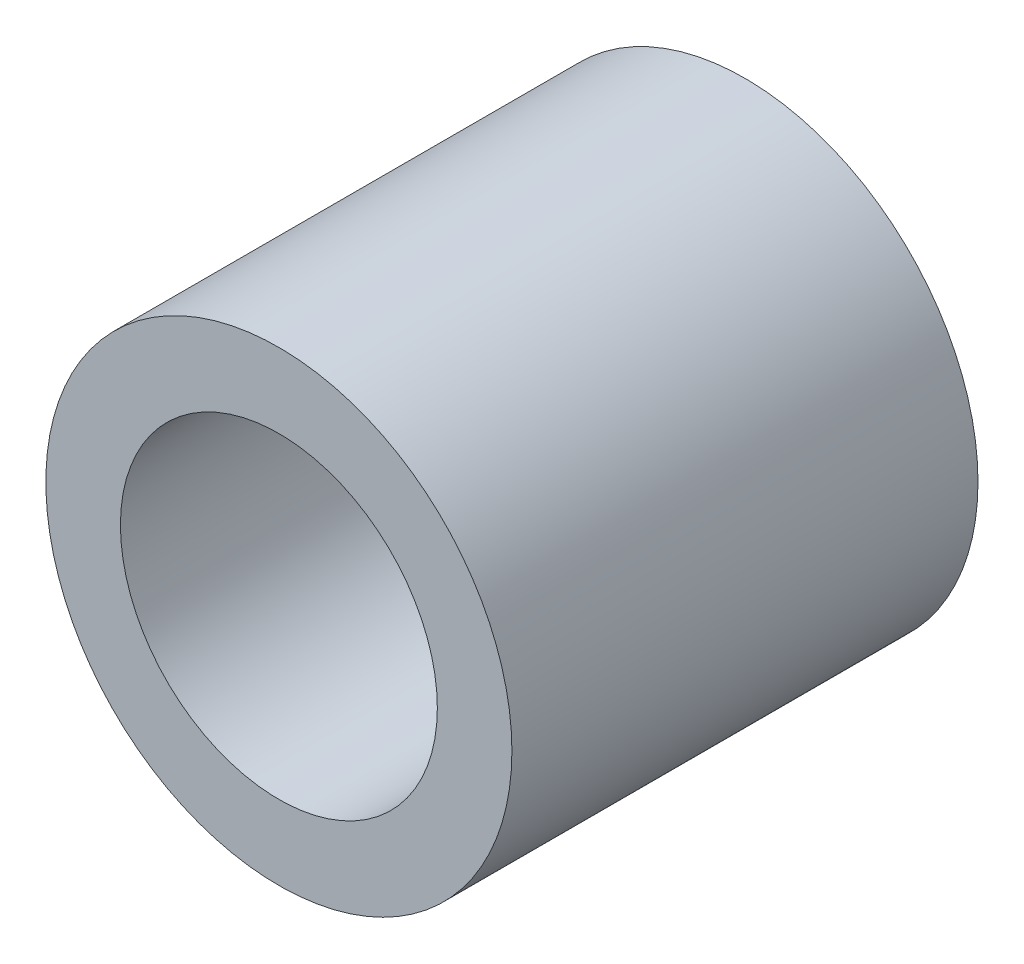
ISO-10303-21;
HEADER;
FILE_DESCRIPTION(('STEP AP214'),'2;1');
FILE_NAME('part.step','',(''),(''),'','','');
FILE_SCHEMA(('AUTOMOTIVE_DESIGN { 1 0 10303 214 1 1 1 1 }'));
ENDSEC;
DATA;
#1=APPLICATION_CONTEXT('core data for automotive mechanical design processes');
#2=APPLICATION_PROTOCOL_DEFINITION('international standard','automotive_design',2000,#1);
#3=PRODUCT_CONTEXT('',#1,'mechanical');
#4=PRODUCT('Part','Part','',(#3));
#5=PRODUCT_RELATED_PRODUCT_CATEGORY('part','',(#4));
#6=PRODUCT_DEFINITION_FORMATION('','',#4);
#7=PRODUCT_DEFINITION_CONTEXT('part definition',#1,'design');
#8=PRODUCT_DEFINITION('design','',#6,#7);
#9=PRODUCT_DEFINITION_SHAPE('','',#8);
#10=(LENGTH_UNIT() NAMED_UNIT(*) SI_UNIT(.MILLI.,.METRE.));
#11=(NAMED_UNIT(*) PLANE_ANGLE_UNIT() SI_UNIT($,.RADIAN.));
#12=(NAMED_UNIT(*) SI_UNIT($,.STERADIAN.) SOLID_ANGLE_UNIT());
#13=UNCERTAINTY_MEASURE_WITH_UNIT(LENGTH_MEASURE(1.E-05),#10,'distance_accuracy_value','');
#14=(GEOMETRIC_REPRESENTATION_CONTEXT(3) GLOBAL_UNCERTAINTY_ASSIGNED_CONTEXT((#13)) GLOBAL_UNIT_ASSIGNED_CONTEXT((#10,
#11,#12)) REPRESENTATION_CONTEXT('',''));
#15=CARTESIAN_POINT('',(0.,0.,0.));
#16=DIRECTION('',(0.,0.,1.));
#17=DIRECTION('',(1.,0.,0.));
#18=AXIS2_PLACEMENT_3D('',#15,#16,#17);
#19=CARTESIAN_POINT('',(-0.962098667726415,1.44549357413392,5.));
#20=DIRECTION('',(0.,0.,1.));
#21=DIRECTION('',(1.,0.,0.));
#22=AXIS2_PLACEMENT_3D('',#19,#20,#21);
#23=PLANE('',#22);
#24=CARTESIAN_POINT('',(-0.962098667726415,1.44549357413392,5.));
#25=DIRECTION('',(0.,0.,1.));
#26=DIRECTION('',(1.,0.,0.));
#27=AXIS2_PLACEMENT_3D('',#24,#25,#26);
#28=CIRCLE('',#27,2.5);
#29=CARTESIAN_POINT('',(1.53790133227359,1.44549357413392,5.));
#30=VERTEX_POINT('',#29);
#31=EDGE_CURVE('E10',#30,#30,#28,.T.);
#32=ORIENTED_EDGE('',*,*,#31,.T.);
#33=EDGE_LOOP('',(#32));
#34=FACE_BOUND('',#33,.T.);
#35=CARTESIAN_POINT('',(-0.962098667726415,1.44549357413392,5.));
#36=DIRECTION('',(0.,0.,1.));
#37=DIRECTION('',(1.,0.,0.));
#38=AXIS2_PLACEMENT_3D('',#35,#36,#37);
#39=CIRCLE('',#38,1.7);
#40=CARTESIAN_POINT('',(0.737901332273585,1.44549357413392,5.));
#41=VERTEX_POINT('',#40);
#42=EDGE_CURVE('E42',#41,#41,#39,.T.);
#43=ORIENTED_EDGE('',*,*,#42,.F.);
#44=EDGE_LOOP('',(#43));
#45=FACE_BOUND('',#44,.T.);
#46=ADVANCED_FACE('F31',(#34,#45),#23,.T.);
#47=CARTESIAN_POINT('',(-0.962098667726415,1.44549357413392,0.));
#48=DIRECTION('',(0.,0.,1.));
#49=DIRECTION('',(1.,0.,0.));
#50=AXIS2_PLACEMENT_3D('',#47,#48,#49);
#51=PLANE('',#50);
#52=CARTESIAN_POINT('',(-0.962098667726415,1.44549357413392,0.));
#53=DIRECTION('',(0.,0.,1.));
#54=DIRECTION('',(1.,0.,0.));
#55=AXIS2_PLACEMENT_3D('',#52,#53,#54);
#56=CIRCLE('',#55,2.5);
#57=CARTESIAN_POINT('',(1.53790133227359,1.44549357413392,0.));
#58=VERTEX_POINT('',#57);
#59=EDGE_CURVE('E35',#58,#58,#56,.T.);
#60=ORIENTED_EDGE('',*,*,#59,.F.);
#61=EDGE_LOOP('',(#60));
#62=FACE_BOUND('',#61,.T.);
#63=CARTESIAN_POINT('',(-0.962098667726415,1.44549357413392,0.));
#64=DIRECTION('',(0.,0.,1.));
#65=DIRECTION('',(1.,0.,0.));
#66=AXIS2_PLACEMENT_3D('',#63,#64,#65);
#67=CIRCLE('',#66,1.7);
#68=CARTESIAN_POINT('',(0.737901332273585,1.44549357413392,0.));
#69=VERTEX_POINT('',#68);
#70=EDGE_CURVE('E44',#69,#69,#67,.T.);
#71=ORIENTED_EDGE('',*,*,#70,.T.);
#72=EDGE_LOOP('',(#71));
#73=FACE_BOUND('',#72,.T.);
#74=ADVANCED_FACE('F54',(#62,#73),#51,.F.);
#75=CARTESIAN_POINT('',(-0.962098667726415,1.44549357413392,5.));
#76=DIRECTION('',(0.,0.,-1.));
#77=DIRECTION('',(-1.,0.,0.));
#78=AXIS2_PLACEMENT_3D('',#75,#76,#77);
#79=CYLINDRICAL_SURFACE('',#78,2.5);
#80=ORIENTED_EDGE('',*,*,#31,.F.);
#81=EDGE_LOOP('',(#80));
#82=FACE_BOUND('',#81,.T.);
#83=ORIENTED_EDGE('',*,*,#59,.T.);
#84=EDGE_LOOP('',(#83));
#85=FACE_BOUND('',#84,.T.);
#86=ADVANCED_FACE('F33',(#82,#85),#79,.T.);
#87=CARTESIAN_POINT('',(-0.962098667726415,1.44549357413392,5.));
#88=DIRECTION('',(0.,0.,-1.));
#89=DIRECTION('',(-1.,0.,0.));
#90=AXIS2_PLACEMENT_3D('',#87,#88,#89);
#91=CYLINDRICAL_SURFACE('',#90,1.7);
#92=ORIENTED_EDGE('',*,*,#42,.T.);
#93=EDGE_LOOP('',(#92));
#94=FACE_BOUND('',#93,.T.);
#95=ORIENTED_EDGE('',*,*,#70,.F.);
#96=EDGE_LOOP('',(#95));
#97=FACE_BOUND('',#96,.T.);
#98=ADVANCED_FACE('F50',(#94,#97),#91,.F.);
#99=CLOSED_SHELL('',(#46,#74,#86,#98));
#100=MANIFOLD_SOLID_BREP('B2',#99);
#101=ADVANCED_BREP_SHAPE_REPRESENTATION('',(#18,#100),#14);
#102=SHAPE_DEFINITION_REPRESENTATION(#9,#101);
ENDSEC;
END-ISO-10303-21;
